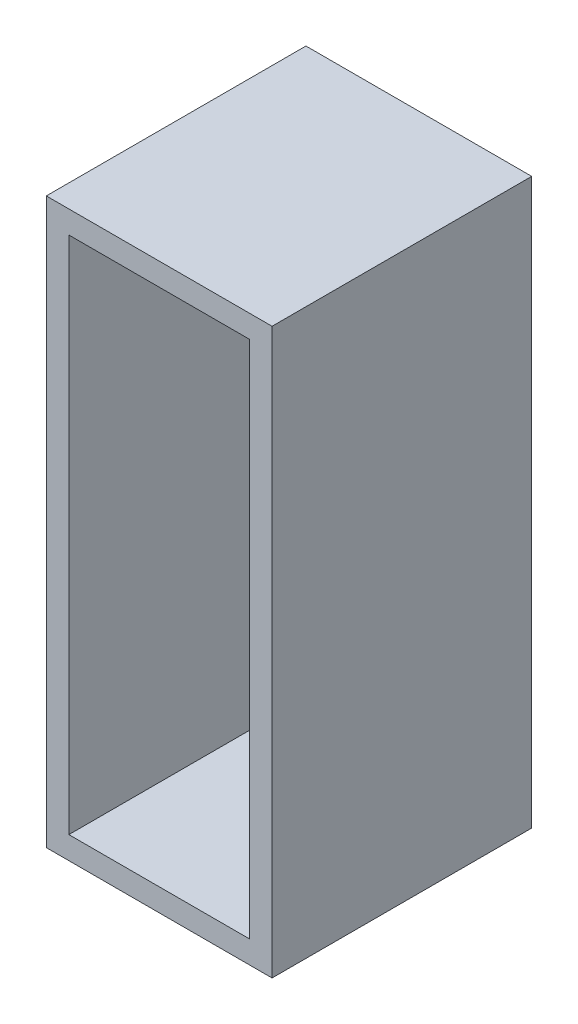
ISO-10303-21;
HEADER;
FILE_DESCRIPTION(('STEP AP214'),'2;1');
FILE_NAME('part.step','',(''),(''),'','','');
FILE_SCHEMA(('AUTOMOTIVE_DESIGN { 1 0 10303 214 1 1 1 1 }'));
ENDSEC;
DATA;
#1=APPLICATION_CONTEXT('core data for automotive mechanical design processes');
#2=APPLICATION_PROTOCOL_DEFINITION('international standard','automotive_design',2000,#1);
#3=PRODUCT_CONTEXT('',#1,'mechanical');
#4=PRODUCT('Part','Part','',(#3));
#5=PRODUCT_RELATED_PRODUCT_CATEGORY('part','',(#4));
#6=PRODUCT_DEFINITION_FORMATION('','',#4);
#7=PRODUCT_DEFINITION_CONTEXT('part definition',#1,'design');
#8=PRODUCT_DEFINITION('design','',#6,#7);
#9=PRODUCT_DEFINITION_SHAPE('','',#8);
#10=(LENGTH_UNIT() NAMED_UNIT(*) SI_UNIT(.MILLI.,.METRE.));
#11=(NAMED_UNIT(*) PLANE_ANGLE_UNIT() SI_UNIT($,.RADIAN.));
#12=(NAMED_UNIT(*) SI_UNIT($,.STERADIAN.) SOLID_ANGLE_UNIT());
#13=UNCERTAINTY_MEASURE_WITH_UNIT(LENGTH_MEASURE(1.E-05),#10,'distance_accuracy_value','');
#14=(GEOMETRIC_REPRESENTATION_CONTEXT(3) GLOBAL_UNCERTAINTY_ASSIGNED_CONTEXT((#13)) GLOBAL_UNIT_ASSIGNED_CONTEXT((#10,
#11,#12)) REPRESENTATION_CONTEXT('',''));
#15=CARTESIAN_POINT('',(0.,0.,0.));
#16=DIRECTION('',(0.,0.,1.));
#17=DIRECTION('',(1.,0.,0.));
#18=AXIS2_PLACEMENT_3D('',#15,#16,#17);
#19=CARTESIAN_POINT('',(-20.,0.,23.));
#20=DIRECTION('',(0.,-1.,0.));
#21=DIRECTION('',(0.,0.,-1.));
#22=AXIS2_PLACEMENT_3D('',#19,#20,#21);
#23=PLANE('',#22);
#24=DIRECTION('',(-1.,0.,0.));
#25=VECTOR('',#24,1.);
#26=CARTESIAN_POINT('',(-20.,0.,0.));
#27=LINE('',#26,#25);
#28=CARTESIAN_POINT('',(0.,0.,0.));
#29=VERTEX_POINT('',#28);
#30=CARTESIAN_POINT('',(-20.,0.,0.));
#31=VERTEX_POINT('',#30);
#32=EDGE_CURVE('E162',#29,#31,#27,.T.);
#33=ORIENTED_EDGE('',*,*,#32,.T.);
#34=DIRECTION('',(0.,0.,-1.));
#35=VECTOR('',#34,1.);
#36=CARTESIAN_POINT('',(-20.,0.,23.));
#37=LINE('',#36,#35);
#38=CARTESIAN_POINT('',(-20.,0.,23.));
#39=VERTEX_POINT('',#38);
#40=EDGE_CURVE('E11',#39,#31,#37,.T.);
#41=ORIENTED_EDGE('',*,*,#40,.F.);
#42=DIRECTION('',(-1.,0.,0.));
#43=VECTOR('',#42,1.);
#44=CARTESIAN_POINT('',(-20.,0.,23.));
#45=LINE('',#44,#43);
#46=CARTESIAN_POINT('',(0.,0.,23.));
#47=VERTEX_POINT('',#46);
#48=EDGE_CURVE('E168',#47,#39,#45,.T.);
#49=ORIENTED_EDGE('',*,*,#48,.F.);
#50=DIRECTION('',(0.,0.,-1.));
#51=VECTOR('',#50,1.);
#52=CARTESIAN_POINT('',(0.,0.,23.));
#53=LINE('',#52,#51);
#54=EDGE_CURVE('E178',#47,#29,#53,.T.);
#55=ORIENTED_EDGE('',*,*,#54,.T.);
#56=EDGE_LOOP('',(#33,#41,#49,#55));
#57=FACE_BOUND('',#56,.T.);
#58=ADVANCED_FACE('F43',(#57),#23,.F.);
#59=CARTESIAN_POINT('',(-20.,-50.,23.));
#60=DIRECTION('',(1.,0.,0.));
#61=DIRECTION('',(0.,0.,-1.));
#62=AXIS2_PLACEMENT_3D('',#59,#60,#61);
#63=PLANE('',#62);
#64=DIRECTION('',(0.,-1.,0.));
#65=VECTOR('',#64,1.);
#66=CARTESIAN_POINT('',(-20.,-50.,0.));
#67=LINE('',#66,#65);
#68=CARTESIAN_POINT('',(-20.,-50.,0.));
#69=VERTEX_POINT('',#68);
#70=EDGE_CURVE('E182',#31,#69,#67,.T.);
#71=ORIENTED_EDGE('',*,*,#70,.T.);
#72=DIRECTION('',(0.,0.,-1.));
#73=VECTOR('',#72,1.);
#74=CARTESIAN_POINT('',(-20.,-50.,23.));
#75=LINE('',#74,#73);
#76=CARTESIAN_POINT('',(-20.,-50.,23.));
#77=VERTEX_POINT('',#76);
#78=EDGE_CURVE('E51',#77,#69,#75,.T.);
#79=ORIENTED_EDGE('',*,*,#78,.F.);
#80=DIRECTION('',(0.,-1.,0.));
#81=VECTOR('',#80,1.);
#82=CARTESIAN_POINT('',(-20.,-50.,23.));
#83=LINE('',#82,#81);
#84=EDGE_CURVE('E95',#39,#77,#83,.T.);
#85=ORIENTED_EDGE('',*,*,#84,.F.);
#86=ORIENTED_EDGE('',*,*,#40,.T.);
#87=EDGE_LOOP('',(#71,#79,#85,#86));
#88=FACE_BOUND('',#87,.T.);
#89=ADVANCED_FACE('F217',(#88),#63,.F.);
#90=CARTESIAN_POINT('',(0.,-50.,23.));
#91=DIRECTION('',(0.,1.,0.));
#92=DIRECTION('',(0.,0.,1.));
#93=AXIS2_PLACEMENT_3D('',#90,#91,#92);
#94=PLANE('',#93);
#95=DIRECTION('',(1.,0.,0.));
#96=VECTOR('',#95,1.);
#97=CARTESIAN_POINT('',(0.,-50.,0.));
#98=LINE('',#97,#96);
#99=CARTESIAN_POINT('',(0.,-50.,0.));
#100=VERTEX_POINT('',#99);
#101=EDGE_CURVE('E185',#69,#100,#98,.T.);
#102=ORIENTED_EDGE('',*,*,#101,.T.);
#103=DIRECTION('',(0.,0.,-1.));
#104=VECTOR('',#103,1.);
#105=CARTESIAN_POINT('',(0.,-50.,23.));
#106=LINE('',#105,#104);
#107=CARTESIAN_POINT('',(0.,-50.,23.));
#108=VERTEX_POINT('',#107);
#109=EDGE_CURVE('E192',#108,#100,#106,.T.);
#110=ORIENTED_EDGE('',*,*,#109,.F.);
#111=DIRECTION('',(1.,0.,0.));
#112=VECTOR('',#111,1.);
#113=CARTESIAN_POINT('',(0.,-50.,23.));
#114=LINE('',#113,#112);
#115=EDGE_CURVE('E173',#77,#108,#114,.T.);
#116=ORIENTED_EDGE('',*,*,#115,.F.);
#117=ORIENTED_EDGE('',*,*,#78,.T.);
#118=EDGE_LOOP('',(#102,#110,#116,#117));
#119=FACE_BOUND('',#118,.T.);
#120=ADVANCED_FACE('F199',(#119),#94,.F.);
#121=CARTESIAN_POINT('',(0.,0.,23.));
#122=DIRECTION('',(-1.,0.,0.));
#123=DIRECTION('',(0.,-1.,0.));
#124=AXIS2_PLACEMENT_3D('',#121,#122,#123);
#125=PLANE('',#124);
#126=DIRECTION('',(0.,1.,0.));
#127=VECTOR('',#126,1.);
#128=CARTESIAN_POINT('',(0.,0.,0.));
#129=LINE('',#128,#127);
#130=EDGE_CURVE('E88',#100,#29,#129,.T.);
#131=ORIENTED_EDGE('',*,*,#130,.T.);
#132=ORIENTED_EDGE('',*,*,#54,.F.);
#133=DIRECTION('',(0.,1.,0.));
#134=VECTOR('',#133,1.);
#135=CARTESIAN_POINT('',(0.,0.,23.));
#136=LINE('',#135,#134);
#137=EDGE_CURVE('E67',#108,#47,#136,.T.);
#138=ORIENTED_EDGE('',*,*,#137,.F.);
#139=ORIENTED_EDGE('',*,*,#109,.T.);
#140=EDGE_LOOP('',(#131,#132,#138,#139));
#141=FACE_BOUND('',#140,.T.);
#142=ADVANCED_FACE('F207',(#141),#125,.F.);
#143=CARTESIAN_POINT('',(0.,0.,23.));
#144=DIRECTION('',(0.,0.,-1.));
#145=DIRECTION('',(-1.,0.,0.));
#146=AXIS2_PLACEMENT_3D('',#143,#144,#145);
#147=PLANE('',#146);
#148=DIRECTION('',(1.,0.,0.));
#149=VECTOR('',#148,1.);
#150=CARTESIAN_POINT('',(-18.,-48.,23.));
#151=LINE('',#150,#149);
#152=CARTESIAN_POINT('',(-18.,-48.,23.));
#153=VERTEX_POINT('',#152);
#154=CARTESIAN_POINT('',(-1.99999999999999,-48.,23.));
#155=VERTEX_POINT('',#154);
#156=EDGE_CURVE('E153',#153,#155,#151,.T.);
#157=ORIENTED_EDGE('',*,*,#156,.F.);
#158=DIRECTION('',(0.,-1.,0.));
#159=VECTOR('',#158,1.);
#160=CARTESIAN_POINT('',(-18.,-2.,23.));
#161=LINE('',#160,#159);
#162=CARTESIAN_POINT('',(-18.,-2.,23.));
#163=VERTEX_POINT('',#162);
#164=EDGE_CURVE('E58',#163,#153,#161,.T.);
#165=ORIENTED_EDGE('',*,*,#164,.F.);
#166=DIRECTION('',(-1.,0.,0.));
#167=VECTOR('',#166,1.);
#168=CARTESIAN_POINT('',(-18.,-2.,23.));
#169=LINE('',#168,#167);
#170=CARTESIAN_POINT('',(-1.99999999999999,-2.,23.));
#171=VERTEX_POINT('',#170);
#172=EDGE_CURVE('E140',#171,#163,#169,.T.);
#173=ORIENTED_EDGE('',*,*,#172,.F.);
#174=DIRECTION('',(0.,1.,0.));
#175=VECTOR('',#174,1.);
#176=CARTESIAN_POINT('',(-1.99999999999999,-2.,23.));
#177=LINE('',#176,#175);
#178=EDGE_CURVE('E144',#155,#171,#177,.T.);
#179=ORIENTED_EDGE('',*,*,#178,.F.);
#180=EDGE_LOOP('',(#157,#165,#173,#179));
#181=FACE_BOUND('',#180,.T.);
#182=ORIENTED_EDGE('',*,*,#48,.T.);
#183=ORIENTED_EDGE('',*,*,#84,.T.);
#184=ORIENTED_EDGE('',*,*,#115,.T.);
#185=ORIENTED_EDGE('',*,*,#137,.T.);
#186=EDGE_LOOP('',(#182,#183,#184,#185));
#187=FACE_BOUND('',#186,.T.);
#188=ADVANCED_FACE('F209',(#181,#187),#147,.F.);
#189=CARTESIAN_POINT('',(0.,0.,0.));
#190=DIRECTION('',(0.,0.,-1.));
#191=DIRECTION('',(-1.,0.,0.));
#192=AXIS2_PLACEMENT_3D('',#189,#190,#191);
#193=PLANE('',#192);
#194=ORIENTED_EDGE('',*,*,#32,.F.);
#195=ORIENTED_EDGE('',*,*,#130,.F.);
#196=ORIENTED_EDGE('',*,*,#101,.F.);
#197=ORIENTED_EDGE('',*,*,#70,.F.);
#198=EDGE_LOOP('',(#194,#195,#196,#197));
#199=FACE_BOUND('',#198,.T.);
#200=ADVANCED_FACE('F203',(#199),#193,.T.);
#201=CARTESIAN_POINT('',(-18.,-2.,2.));
#202=DIRECTION('',(-1.,0.,0.));
#203=DIRECTION('',(0.,-1.,0.));
#204=AXIS2_PLACEMENT_3D('',#201,#202,#203);
#205=PLANE('',#204);
#206=ORIENTED_EDGE('',*,*,#164,.T.);
#207=DIRECTION('',(0.,0.,1.));
#208=VECTOR('',#207,1.);
#209=CARTESIAN_POINT('',(-18.,-48.,2.));
#210=LINE('',#209,#208);
#211=CARTESIAN_POINT('',(-18.,-48.,2.));
#212=VERTEX_POINT('',#211);
#213=EDGE_CURVE('E115',#212,#153,#210,.T.);
#214=ORIENTED_EDGE('',*,*,#213,.F.);
#215=DIRECTION('',(0.,-1.,0.));
#216=VECTOR('',#215,1.);
#217=CARTESIAN_POINT('',(-18.,-2.,2.));
#218=LINE('',#217,#216);
#219=CARTESIAN_POINT('',(-18.,-2.,2.));
#220=VERTEX_POINT('',#219);
#221=EDGE_CURVE('E119',#220,#212,#218,.T.);
#222=ORIENTED_EDGE('',*,*,#221,.F.);
#223=DIRECTION('',(0.,0.,1.));
#224=VECTOR('',#223,1.);
#225=CARTESIAN_POINT('',(-18.,-2.,2.));
#226=LINE('',#225,#224);
#227=EDGE_CURVE('E159',#220,#163,#226,.T.);
#228=ORIENTED_EDGE('',*,*,#227,.T.);
#229=EDGE_LOOP('',(#206,#214,#222,#228));
#230=FACE_BOUND('',#229,.T.);
#231=ADVANCED_FACE('F117',(#230),#205,.F.);
#232=CARTESIAN_POINT('',(-18.,-2.,2.));
#233=DIRECTION('',(0.,1.,0.));
#234=DIRECTION('',(0.,0.,1.));
#235=AXIS2_PLACEMENT_3D('',#232,#233,#234);
#236=PLANE('',#235);
#237=ORIENTED_EDGE('',*,*,#172,.T.);
#238=ORIENTED_EDGE('',*,*,#227,.F.);
#239=DIRECTION('',(-1.,0.,0.));
#240=VECTOR('',#239,1.);
#241=CARTESIAN_POINT('',(-18.,-2.,2.));
#242=LINE('',#241,#240);
#243=CARTESIAN_POINT('',(-1.99999999999999,-2.,2.));
#244=VERTEX_POINT('',#243);
#245=EDGE_CURVE('E126',#244,#220,#242,.T.);
#246=ORIENTED_EDGE('',*,*,#245,.F.);
#247=DIRECTION('',(0.,0.,1.));
#248=VECTOR('',#247,1.);
#249=CARTESIAN_POINT('',(-1.99999999999999,-2.,2.));
#250=LINE('',#249,#248);
#251=EDGE_CURVE('E163',#244,#171,#250,.T.);
#252=ORIENTED_EDGE('',*,*,#251,.T.);
#253=EDGE_LOOP('',(#237,#238,#246,#252));
#254=FACE_BOUND('',#253,.T.);
#255=ADVANCED_FACE('F260',(#254),#236,.F.);
#256=CARTESIAN_POINT('',(-1.99999999999999,-2.,2.));
#257=DIRECTION('',(1.,0.,0.));
#258=DIRECTION('',(0.,1.,0.));
#259=AXIS2_PLACEMENT_3D('',#256,#257,#258);
#260=PLANE('',#259);
#261=ORIENTED_EDGE('',*,*,#178,.T.);
#262=ORIENTED_EDGE('',*,*,#251,.F.);
#263=DIRECTION('',(0.,1.,0.));
#264=VECTOR('',#263,1.);
#265=CARTESIAN_POINT('',(-1.99999999999999,-2.,2.));
#266=LINE('',#265,#264);
#267=CARTESIAN_POINT('',(-1.99999999999999,-48.,2.));
#268=VERTEX_POINT('',#267);
#269=EDGE_CURVE('E135',#268,#244,#266,.T.);
#270=ORIENTED_EDGE('',*,*,#269,.F.);
#271=DIRECTION('',(0.,0.,1.));
#272=VECTOR('',#271,1.);
#273=CARTESIAN_POINT('',(-1.99999999999999,-48.,2.));
#274=LINE('',#273,#272);
#275=EDGE_CURVE('E125',#268,#155,#274,.T.);
#276=ORIENTED_EDGE('',*,*,#275,.T.);
#277=EDGE_LOOP('',(#261,#262,#270,#276));
#278=FACE_BOUND('',#277,.T.);
#279=ADVANCED_FACE('F270',(#278),#260,.F.);
#280=CARTESIAN_POINT('',(-18.,-48.,2.));
#281=DIRECTION('',(0.,-1.,0.));
#282=DIRECTION('',(0.,0.,-1.));
#283=AXIS2_PLACEMENT_3D('',#280,#281,#282);
#284=PLANE('',#283);
#285=ORIENTED_EDGE('',*,*,#156,.T.);
#286=ORIENTED_EDGE('',*,*,#275,.F.);
#287=DIRECTION('',(1.,0.,0.));
#288=VECTOR('',#287,1.);
#289=CARTESIAN_POINT('',(-18.,-48.,2.));
#290=LINE('',#289,#288);
#291=EDGE_CURVE('E129',#212,#268,#290,.T.);
#292=ORIENTED_EDGE('',*,*,#291,.F.);
#293=ORIENTED_EDGE('',*,*,#213,.T.);
#294=EDGE_LOOP('',(#285,#286,#292,#293));
#295=FACE_BOUND('',#294,.T.);
#296=ADVANCED_FACE('F130',(#295),#284,.F.);
#297=CARTESIAN_POINT('',(0.,0.,2.));
#298=DIRECTION('',(0.,0.,1.));
#299=DIRECTION('',(1.,0.,0.));
#300=AXIS2_PLACEMENT_3D('',#297,#298,#299);
#301=PLANE('',#300);
#302=ORIENTED_EDGE('',*,*,#221,.T.);
#303=ORIENTED_EDGE('',*,*,#291,.T.);
#304=ORIENTED_EDGE('',*,*,#269,.T.);
#305=ORIENTED_EDGE('',*,*,#245,.T.);
#306=EDGE_LOOP('',(#302,#303,#304,#305));
#307=FACE_BOUND('',#306,.T.);
#308=ADVANCED_FACE('F137',(#307),#301,.T.);
#309=CLOSED_SHELL('',(#58,#89,#120,#142,#188,#200,#231,#255,#279,#296,#308));
#310=MANIFOLD_SOLID_BREP('B2',#309);
#311=ADVANCED_BREP_SHAPE_REPRESENTATION('',(#18,#310),#14);
#312=SHAPE_DEFINITION_REPRESENTATION(#9,#311);
ENDSEC;
END-ISO-10303-21;
